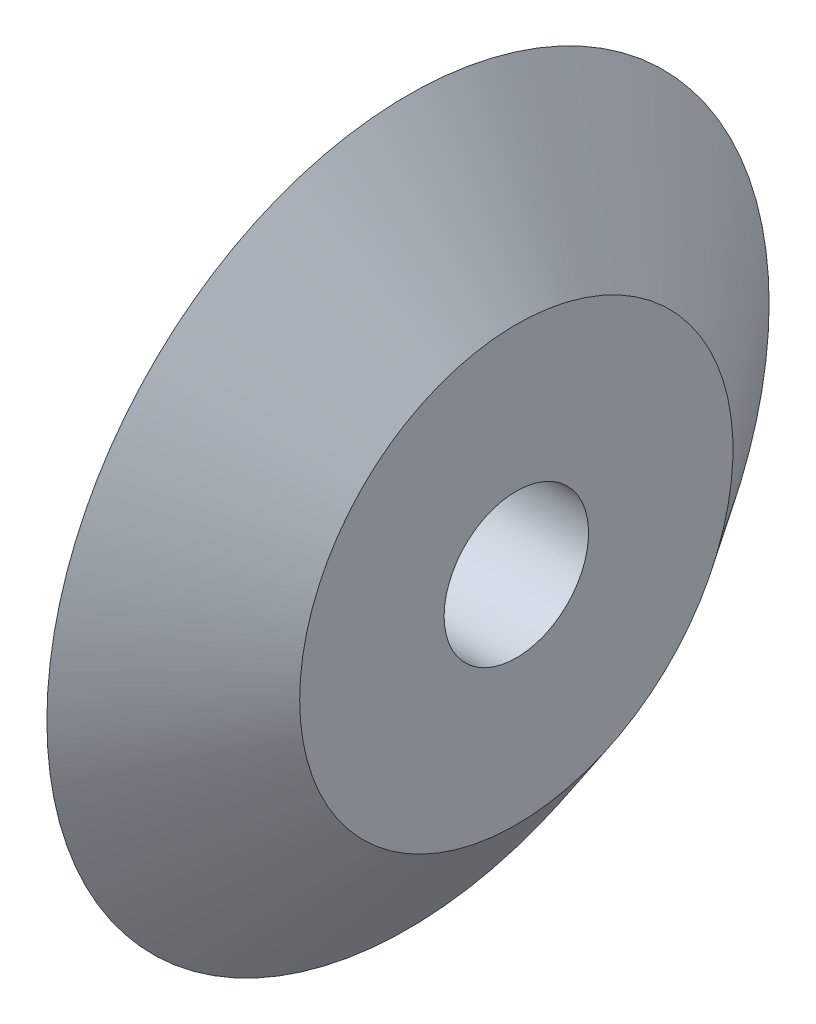
ISO-10303-21;
HEADER;
FILE_DESCRIPTION(('STEP AP214'),'2;1');
FILE_NAME('part.step','',(''),(''),'','','');
FILE_SCHEMA(('AUTOMOTIVE_DESIGN { 1 0 10303 214 1 1 1 1 }'));
ENDSEC;
DATA;
#1=APPLICATION_CONTEXT('core data for automotive mechanical design processes');
#2=APPLICATION_PROTOCOL_DEFINITION('international standard','automotive_design',2000,#1);
#3=PRODUCT_CONTEXT('',#1,'mechanical');
#4=PRODUCT('Part','Part','',(#3));
#5=PRODUCT_RELATED_PRODUCT_CATEGORY('part','',(#4));
#6=PRODUCT_DEFINITION_FORMATION('','',#4);
#7=PRODUCT_DEFINITION_CONTEXT('part definition',#1,'design');
#8=PRODUCT_DEFINITION('design','',#6,#7);
#9=PRODUCT_DEFINITION_SHAPE('','',#8);
#10=(LENGTH_UNIT() NAMED_UNIT(*) SI_UNIT(.MILLI.,.METRE.));
#11=(NAMED_UNIT(*) PLANE_ANGLE_UNIT() SI_UNIT($,.RADIAN.));
#12=(NAMED_UNIT(*) SI_UNIT($,.STERADIAN.) SOLID_ANGLE_UNIT());
#13=UNCERTAINTY_MEASURE_WITH_UNIT(LENGTH_MEASURE(1.E-05),#10,'distance_accuracy_value','');
#14=(GEOMETRIC_REPRESENTATION_CONTEXT(3) GLOBAL_UNCERTAINTY_ASSIGNED_CONTEXT((#13)) GLOBAL_UNIT_ASSIGNED_CONTEXT((#10,
#11,#12)) REPRESENTATION_CONTEXT('',''));
#15=CARTESIAN_POINT('',(0.,0.,0.));
#16=DIRECTION('',(0.,0.,1.));
#17=DIRECTION('',(1.,0.,0.));
#18=AXIS2_PLACEMENT_3D('',#15,#16,#17);
#19=CARTESIAN_POINT('',(0.,0.,0.));
#20=DIRECTION('',(-1.,0.,0.));
#21=DIRECTION('',(0.,0.,1.));
#22=AXIS2_PLACEMENT_3D('',#19,#20,#21);
#23=CYLINDRICAL_SURFACE('',#22,10.);
#24=CARTESIAN_POINT('',(15.,0.,0.));
#25=DIRECTION('',(-1.,0.,0.));
#26=DIRECTION('',(0.,0.,1.));
#27=AXIS2_PLACEMENT_3D('',#24,#25,#26);
#28=CIRCLE('',#27,10.);
#29=CARTESIAN_POINT('',(15.,0.,10.));
#30=VERTEX_POINT('',#29);
#31=EDGE_CURVE('E47',#30,#30,#28,.T.);
#32=ORIENTED_EDGE('',*,*,#31,.F.);
#33=EDGE_LOOP('',(#32));
#34=FACE_BOUND('',#33,.T.);
#35=CARTESIAN_POINT('',(0.,0.,0.));
#36=DIRECTION('',(-1.,0.,0.));
#37=DIRECTION('',(0.,0.,1.));
#38=AXIS2_PLACEMENT_3D('',#35,#36,#37);
#39=CIRCLE('',#38,10.);
#40=CARTESIAN_POINT('',(0.,0.,10.));
#41=VERTEX_POINT('',#40);
#42=EDGE_CURVE('E10',#41,#41,#39,.T.);
#43=ORIENTED_EDGE('',*,*,#42,.T.);
#44=EDGE_LOOP('',(#43));
#45=FACE_BOUND('',#44,.T.);
#46=ADVANCED_FACE('F33',(#34,#45),#23,.F.);
#47=CARTESIAN_POINT('',(0.,10.,0.));
#48=DIRECTION('',(1.,0.,0.));
#49=DIRECTION('',(0.,0.,-1.));
#50=AXIS2_PLACEMENT_3D('',#47,#48,#49);
#51=PLANE('',#50);
#52=ORIENTED_EDGE('',*,*,#42,.F.);
#53=EDGE_LOOP('',(#52));
#54=FACE_BOUND('',#53,.T.);
#55=CARTESIAN_POINT('',(0.,0.,0.));
#56=DIRECTION('',(-1.,0.,0.));
#57=DIRECTION('',(0.,0.,1.));
#58=AXIS2_PLACEMENT_3D('',#55,#56,#57);
#59=CIRCLE('',#58,50.);
#60=CARTESIAN_POINT('',(0.,0.,50.));
#61=VERTEX_POINT('',#60);
#62=EDGE_CURVE('E39',#61,#61,#59,.T.);
#63=ORIENTED_EDGE('',*,*,#62,.T.);
#64=EDGE_LOOP('',(#63));
#65=FACE_BOUND('',#64,.T.);
#66=ADVANCED_FACE('F56',(#54,#65),#51,.F.);
#67=CARTESIAN_POINT('',(15.,0.,0.));
#68=DIRECTION('',(-1.,0.,0.));
#69=DIRECTION('',(0.,0.,1.));
#70=AXIS2_PLACEMENT_3D('',#67,#68,#69);
#71=CONICAL_SURFACE('',#70,30.,0.927295218001612);
#72=ORIENTED_EDGE('',*,*,#62,.F.);
#73=EDGE_LOOP('',(#72));
#74=FACE_BOUND('',#73,.T.);
#75=CARTESIAN_POINT('',(15.,0.,0.));
#76=DIRECTION('',(-1.,0.,0.));
#77=DIRECTION('',(0.,0.,1.));
#78=AXIS2_PLACEMENT_3D('',#75,#76,#77);
#79=CIRCLE('',#78,30.);
#80=CARTESIAN_POINT('',(15.,0.,30.));
#81=VERTEX_POINT('',#80);
#82=EDGE_CURVE('E43',#81,#81,#79,.T.);
#83=ORIENTED_EDGE('',*,*,#82,.T.);
#84=EDGE_LOOP('',(#83));
#85=FACE_BOUND('',#84,.T.);
#86=ADVANCED_FACE('F60',(#74,#85),#71,.T.);
#87=CARTESIAN_POINT('',(15.,30.,0.));
#88=DIRECTION('',(-1.,0.,0.));
#89=DIRECTION('',(0.,0.,1.));
#90=AXIS2_PLACEMENT_3D('',#87,#88,#89);
#91=PLANE('',#90);
#92=ORIENTED_EDGE('',*,*,#82,.F.);
#93=EDGE_LOOP('',(#92));
#94=FACE_BOUND('',#93,.T.);
#95=ORIENTED_EDGE('',*,*,#31,.T.);
#96=EDGE_LOOP('',(#95));
#97=FACE_BOUND('',#96,.T.);
#98=ADVANCED_FACE('F53',(#94,#97),#91,.F.);
#99=CLOSED_SHELL('',(#46,#66,#86,#98));
#100=MANIFOLD_SOLID_BREP('B2',#99);
#101=ADVANCED_BREP_SHAPE_REPRESENTATION('',(#18,#100),#14);
#102=SHAPE_DEFINITION_REPRESENTATION(#9,#101);
ENDSEC;
END-ISO-10303-21;
